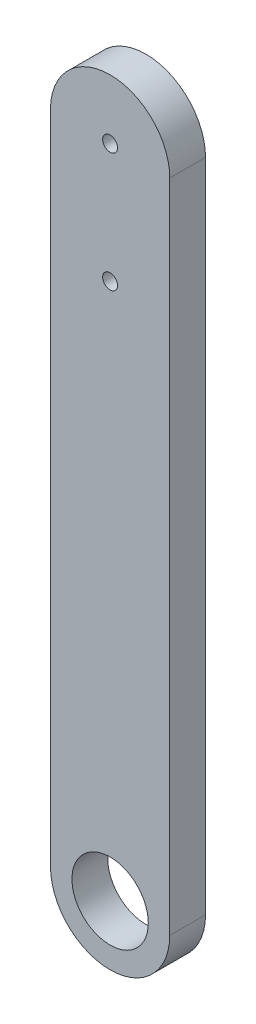
ISO-10303-21;
HEADER;
FILE_DESCRIPTION(('STEP AP214'),'2;1');
FILE_NAME('part.step','',(''),(''),'','','');
FILE_SCHEMA(('AUTOMOTIVE_DESIGN { 1 0 10303 214 1 1 1 1 }'));
ENDSEC;
DATA;
#1=APPLICATION_CONTEXT('core data for automotive mechanical design processes');
#2=APPLICATION_PROTOCOL_DEFINITION('international standard','automotive_design',2000,#1);
#3=PRODUCT_CONTEXT('',#1,'mechanical');
#4=PRODUCT('Part','Part','',(#3));
#5=PRODUCT_RELATED_PRODUCT_CATEGORY('part','',(#4));
#6=PRODUCT_DEFINITION_FORMATION('','',#4);
#7=PRODUCT_DEFINITION_CONTEXT('part definition',#1,'design');
#8=PRODUCT_DEFINITION('design','',#6,#7);
#9=PRODUCT_DEFINITION_SHAPE('','',#8);
#10=(LENGTH_UNIT() NAMED_UNIT(*) SI_UNIT(.MILLI.,.METRE.));
#11=(NAMED_UNIT(*) PLANE_ANGLE_UNIT() SI_UNIT($,.RADIAN.));
#12=(NAMED_UNIT(*) SI_UNIT($,.STERADIAN.) SOLID_ANGLE_UNIT());
#13=UNCERTAINTY_MEASURE_WITH_UNIT(LENGTH_MEASURE(1.E-05),#10,'distance_accuracy_value','');
#14=(GEOMETRIC_REPRESENTATION_CONTEXT(3) GLOBAL_UNCERTAINTY_ASSIGNED_CONTEXT((#13)) GLOBAL_UNIT_ASSIGNED_CONTEXT((#10,
#11,#12)) REPRESENTATION_CONTEXT('',''));
#15=CARTESIAN_POINT('',(0.,0.,0.));
#16=DIRECTION('',(0.,0.,1.));
#17=DIRECTION('',(1.,0.,0.));
#18=AXIS2_PLACEMENT_3D('',#15,#16,#17);
#19=CARTESIAN_POINT('',(-69.1410726802654,-13.6999999999981,6.));
#20=DIRECTION('',(0.,0.,1.));
#21=DIRECTION('',(1.,0.,0.));
#22=AXIS2_PLACEMENT_3D('',#19,#20,#21);
#23=PLANE('',#22);
#24=CARTESIAN_POINT('',(-69.1410726802654,-13.6999999999981,6.));
#25=DIRECTION('',(0.,0.,1.));
#26=DIRECTION('',(1.,0.,0.));
#27=AXIS2_PLACEMENT_3D('',#24,#25,#26);
#28=CIRCLE('',#27,1.24999999999997);
#29=CARTESIAN_POINT('',(-67.8910726802655,-13.6999999999981,6.));
#30=VERTEX_POINT('',#29);
#31=EDGE_CURVE('E142',#30,#30,#28,.T.);
#32=ORIENTED_EDGE('',*,*,#31,.F.);
#33=EDGE_LOOP('',(#32));
#34=FACE_BOUND('',#33,.T.);
#35=CARTESIAN_POINT('',(-69.1410726802654,-13.6999999999981,6.));
#36=DIRECTION('',(0.,0.,1.));
#37=DIRECTION('',(1.,0.,0.));
#38=AXIS2_PLACEMENT_3D('',#35,#36,#37);
#39=CIRCLE('',#38,10.);
#40=CARTESIAN_POINT('',(-59.1410726802654,-13.6999999999981,6.));
#41=VERTEX_POINT('',#40);
#42=CARTESIAN_POINT('',(-79.1410726802655,-13.6999999999981,6.));
#43=VERTEX_POINT('',#42);
#44=EDGE_CURVE('E98',#41,#43,#39,.T.);
#45=ORIENTED_EDGE('',*,*,#44,.T.);
#46=DIRECTION('',(0.,-1.,0.));
#47=VECTOR('',#46,1.);
#48=CARTESIAN_POINT('',(-79.1410726802655,-13.6999999999981,6.));
#49=LINE('',#48,#47);
#50=CARTESIAN_POINT('',(-79.1410726802654,-123.699999999998,6.));
#51=VERTEX_POINT('',#50);
#52=EDGE_CURVE('E93',#43,#51,#49,.T.);
#53=ORIENTED_EDGE('',*,*,#52,.T.);
#54=CARTESIAN_POINT('',(-69.1410726802654,-123.699999999998,6.));
#55=DIRECTION('',(0.,0.,1.));
#56=DIRECTION('',(1.,0.,0.));
#57=AXIS2_PLACEMENT_3D('',#54,#55,#56);
#58=CIRCLE('',#57,10.);
#59=CARTESIAN_POINT('',(-59.1410726802654,-123.699999999998,6.));
#60=VERTEX_POINT('',#59);
#61=EDGE_CURVE('E96',#51,#60,#58,.T.);
#62=ORIENTED_EDGE('',*,*,#61,.T.);
#63=DIRECTION('',(0.,1.,0.));
#64=VECTOR('',#63,1.);
#65=CARTESIAN_POINT('',(-59.1410726802654,-123.699999999998,6.));
#66=LINE('',#65,#64);
#67=EDGE_CURVE('E63',#60,#41,#66,.T.);
#68=ORIENTED_EDGE('',*,*,#67,.T.);
#69=EDGE_LOOP('',(#45,#53,#62,#68));
#70=FACE_BOUND('',#69,.T.);
#71=CARTESIAN_POINT('',(-69.1410726802654,-33.6999999999981,6.));
#72=DIRECTION('',(0.,0.,1.));
#73=DIRECTION('',(1.,0.,0.));
#74=AXIS2_PLACEMENT_3D('',#71,#72,#73);
#75=CIRCLE('',#74,1.24999999999999);
#76=CARTESIAN_POINT('',(-67.8910726802654,-33.6999999999981,6.));
#77=VERTEX_POINT('',#76);
#78=EDGE_CURVE('E120',#77,#77,#75,.T.);
#79=ORIENTED_EDGE('',*,*,#78,.F.);
#80=EDGE_LOOP('',(#79));
#81=FACE_BOUND('',#80,.T.);
#82=CARTESIAN_POINT('',(-69.1410726802654,-123.699999999998,6.));
#83=DIRECTION('',(0.,0.,1.));
#84=DIRECTION('',(1.,0.,0.));
#85=AXIS2_PLACEMENT_3D('',#82,#83,#84);
#86=CIRCLE('',#85,6.40000000000001);
#87=CARTESIAN_POINT('',(-62.7410726802654,-123.699999999998,6.));
#88=VERTEX_POINT('',#87);
#89=EDGE_CURVE('E150',#88,#88,#86,.T.);
#90=ORIENTED_EDGE('',*,*,#89,.F.);
#91=EDGE_LOOP('',(#90));
#92=FACE_BOUND('',#91,.T.);
#93=ADVANCED_FACE('F45',(#34,#70,#81,#92),#23,.T.);
#94=CARTESIAN_POINT('',(-69.1410726802654,-13.6999999999981,0.));
#95=DIRECTION('',(0.,0.,1.));
#96=DIRECTION('',(1.,0.,0.));
#97=AXIS2_PLACEMENT_3D('',#94,#95,#96);
#98=PLANE('',#97);
#99=CARTESIAN_POINT('',(-69.1410726802654,-13.6999999999981,0.));
#100=DIRECTION('',(0.,0.,1.));
#101=DIRECTION('',(1.,0.,0.));
#102=AXIS2_PLACEMENT_3D('',#99,#100,#101);
#103=CIRCLE('',#102,10.);
#104=CARTESIAN_POINT('',(-59.1410726802654,-13.6999999999981,0.));
#105=VERTEX_POINT('',#104);
#106=CARTESIAN_POINT('',(-79.1410726802655,-13.6999999999981,0.));
#107=VERTEX_POINT('',#106);
#108=EDGE_CURVE('E116',#105,#107,#103,.T.);
#109=ORIENTED_EDGE('',*,*,#108,.F.);
#110=DIRECTION('',(0.,1.,0.));
#111=VECTOR('',#110,1.);
#112=CARTESIAN_POINT('',(-59.1410726802654,-123.699999999998,0.));
#113=LINE('',#112,#111);
#114=CARTESIAN_POINT('',(-59.1410726802654,-123.699999999998,0.));
#115=VERTEX_POINT('',#114);
#116=EDGE_CURVE('E86',#115,#105,#113,.T.);
#117=ORIENTED_EDGE('',*,*,#116,.F.);
#118=CARTESIAN_POINT('',(-69.1410726802654,-123.699999999998,0.));
#119=DIRECTION('',(0.,0.,1.));
#120=DIRECTION('',(1.,0.,0.));
#121=AXIS2_PLACEMENT_3D('',#118,#119,#120);
#122=CIRCLE('',#121,10.);
#123=CARTESIAN_POINT('',(-79.1410726802654,-123.699999999998,0.));
#124=VERTEX_POINT('',#123);
#125=EDGE_CURVE('E80',#124,#115,#122,.T.);
#126=ORIENTED_EDGE('',*,*,#125,.F.);
#127=DIRECTION('',(0.,-1.,0.));
#128=VECTOR('',#127,1.);
#129=CARTESIAN_POINT('',(-79.1410726802655,-13.6999999999981,0.));
#130=LINE('',#129,#128);
#131=EDGE_CURVE('E103',#107,#124,#130,.T.);
#132=ORIENTED_EDGE('',*,*,#131,.F.);
#133=EDGE_LOOP('',(#109,#117,#126,#132));
#134=FACE_BOUND('',#133,.T.);
#135=CARTESIAN_POINT('',(-69.1410726802654,-33.6999999999981,0.));
#136=DIRECTION('',(0.,0.,1.));
#137=DIRECTION('',(1.,0.,0.));
#138=AXIS2_PLACEMENT_3D('',#135,#136,#137);
#139=CIRCLE('',#138,1.24999999999999);
#140=CARTESIAN_POINT('',(-67.8910726802654,-33.6999999999981,0.));
#141=VERTEX_POINT('',#140);
#142=EDGE_CURVE('E139',#141,#141,#139,.T.);
#143=ORIENTED_EDGE('',*,*,#142,.T.);
#144=EDGE_LOOP('',(#143));
#145=FACE_BOUND('',#144,.T.);
#146=CARTESIAN_POINT('',(-69.1410726802654,-13.6999999999981,0.));
#147=DIRECTION('',(0.,0.,1.));
#148=DIRECTION('',(1.,0.,0.));
#149=AXIS2_PLACEMENT_3D('',#146,#147,#148);
#150=CIRCLE('',#149,1.24999999999997);
#151=CARTESIAN_POINT('',(-67.8910726802655,-13.6999999999981,0.));
#152=VERTEX_POINT('',#151);
#153=EDGE_CURVE('E146',#152,#152,#150,.T.);
#154=ORIENTED_EDGE('',*,*,#153,.T.);
#155=EDGE_LOOP('',(#154));
#156=FACE_BOUND('',#155,.T.);
#157=CARTESIAN_POINT('',(-69.1410726802654,-123.699999999998,0.));
#158=DIRECTION('',(0.,0.,1.));
#159=DIRECTION('',(1.,0.,0.));
#160=AXIS2_PLACEMENT_3D('',#157,#158,#159);
#161=CIRCLE('',#160,6.40000000000001);
#162=CARTESIAN_POINT('',(-62.7410726802654,-123.699999999998,0.));
#163=VERTEX_POINT('',#162);
#164=EDGE_CURVE('E153',#163,#163,#161,.T.);
#165=ORIENTED_EDGE('',*,*,#164,.T.);
#166=EDGE_LOOP('',(#165));
#167=FACE_BOUND('',#166,.T.);
#168=ADVANCED_FACE('F134',(#134,#145,#156,#167),#98,.F.);
#169=CARTESIAN_POINT('',(-69.1410726802654,-13.6999999999981,6.));
#170=DIRECTION('',(0.,0.,-1.));
#171=DIRECTION('',(-1.,0.,0.));
#172=AXIS2_PLACEMENT_3D('',#169,#170,#171);
#173=CYLINDRICAL_SURFACE('',#172,10.);
#174=ORIENTED_EDGE('',*,*,#108,.T.);
#175=DIRECTION('',(0.,0.,-1.));
#176=VECTOR('',#175,1.);
#177=CARTESIAN_POINT('',(-79.1410726802655,-13.6999999999981,6.));
#178=LINE('',#177,#176);
#179=EDGE_CURVE('E11',#43,#107,#178,.T.);
#180=ORIENTED_EDGE('',*,*,#179,.F.);
#181=ORIENTED_EDGE('',*,*,#44,.F.);
#182=DIRECTION('',(0.,0.,-1.));
#183=VECTOR('',#182,1.);
#184=CARTESIAN_POINT('',(-59.1410726802654,-13.6999999999981,6.));
#185=LINE('',#184,#183);
#186=EDGE_CURVE('E112',#41,#105,#185,.T.);
#187=ORIENTED_EDGE('',*,*,#186,.T.);
#188=EDGE_LOOP('',(#174,#180,#181,#187));
#189=FACE_BOUND('',#188,.T.);
#190=ADVANCED_FACE('F47',(#189),#173,.T.);
#191=CARTESIAN_POINT('',(-79.1410726802655,-13.6999999999981,6.));
#192=DIRECTION('',(1.,0.,0.));
#193=DIRECTION('',(0.,1.,0.));
#194=AXIS2_PLACEMENT_3D('',#191,#192,#193);
#195=PLANE('',#194);
#196=ORIENTED_EDGE('',*,*,#131,.T.);
#197=DIRECTION('',(0.,0.,-1.));
#198=VECTOR('',#197,1.);
#199=CARTESIAN_POINT('',(-79.1410726802654,-123.699999999998,6.));
#200=LINE('',#199,#198);
#201=EDGE_CURVE('E55',#51,#124,#200,.T.);
#202=ORIENTED_EDGE('',*,*,#201,.F.);
#203=ORIENTED_EDGE('',*,*,#52,.F.);
#204=ORIENTED_EDGE('',*,*,#179,.T.);
#205=EDGE_LOOP('',(#196,#202,#203,#204));
#206=FACE_BOUND('',#205,.T.);
#207=ADVANCED_FACE('F102',(#206),#195,.F.);
#208=CARTESIAN_POINT('',(-69.1410726802654,-123.699999999998,6.));
#209=DIRECTION('',(0.,0.,-1.));
#210=DIRECTION('',(-1.,0.,0.));
#211=AXIS2_PLACEMENT_3D('',#208,#209,#210);
#212=CYLINDRICAL_SURFACE('',#211,10.);
#213=ORIENTED_EDGE('',*,*,#125,.T.);
#214=DIRECTION('',(0.,0.,-1.));
#215=VECTOR('',#214,1.);
#216=CARTESIAN_POINT('',(-59.1410726802654,-123.699999999998,6.));
#217=LINE('',#216,#215);
#218=EDGE_CURVE('E105',#60,#115,#217,.T.);
#219=ORIENTED_EDGE('',*,*,#218,.F.);
#220=ORIENTED_EDGE('',*,*,#61,.F.);
#221=ORIENTED_EDGE('',*,*,#201,.T.);
#222=EDGE_LOOP('',(#213,#219,#220,#221));
#223=FACE_BOUND('',#222,.T.);
#224=ADVANCED_FACE('F106',(#223),#212,.T.);
#225=CARTESIAN_POINT('',(-59.1410726802654,-123.699999999998,6.));
#226=DIRECTION('',(-1.,0.,0.));
#227=DIRECTION('',(0.,-1.,0.));
#228=AXIS2_PLACEMENT_3D('',#225,#226,#227);
#229=PLANE('',#228);
#230=ORIENTED_EDGE('',*,*,#116,.T.);
#231=ORIENTED_EDGE('',*,*,#186,.F.);
#232=ORIENTED_EDGE('',*,*,#67,.F.);
#233=ORIENTED_EDGE('',*,*,#218,.T.);
#234=EDGE_LOOP('',(#230,#231,#232,#233));
#235=FACE_BOUND('',#234,.T.);
#236=ADVANCED_FACE('F131',(#235),#229,.F.);
#237=CARTESIAN_POINT('',(-69.1410726802654,-33.6999999999981,6.));
#238=DIRECTION('',(0.,0.,-1.));
#239=DIRECTION('',(-1.,0.,0.));
#240=AXIS2_PLACEMENT_3D('',#237,#238,#239);
#241=CYLINDRICAL_SURFACE('',#240,1.24999999999999);
#242=ORIENTED_EDGE('',*,*,#78,.T.);
#243=EDGE_LOOP('',(#242));
#244=FACE_BOUND('',#243,.T.);
#245=ORIENTED_EDGE('',*,*,#142,.F.);
#246=EDGE_LOOP('',(#245));
#247=FACE_BOUND('',#246,.T.);
#248=ADVANCED_FACE('F171',(#244,#247),#241,.F.);
#249=CARTESIAN_POINT('',(-69.1410726802654,-13.6999999999981,6.));
#250=DIRECTION('',(0.,0.,-1.));
#251=DIRECTION('',(-1.,0.,0.));
#252=AXIS2_PLACEMENT_3D('',#249,#250,#251);
#253=CYLINDRICAL_SURFACE('',#252,1.24999999999997);
#254=ORIENTED_EDGE('',*,*,#31,.T.);
#255=EDGE_LOOP('',(#254));
#256=FACE_BOUND('',#255,.T.);
#257=ORIENTED_EDGE('',*,*,#153,.F.);
#258=EDGE_LOOP('',(#257));
#259=FACE_BOUND('',#258,.T.);
#260=ADVANCED_FACE('F236',(#256,#259),#253,.F.);
#261=CARTESIAN_POINT('',(-69.1410726802654,-123.699999999998,6.));
#262=DIRECTION('',(0.,0.,-1.));
#263=DIRECTION('',(-1.,0.,0.));
#264=AXIS2_PLACEMENT_3D('',#261,#262,#263);
#265=CYLINDRICAL_SURFACE('',#264,6.40000000000001);
#266=ORIENTED_EDGE('',*,*,#89,.T.);
#267=EDGE_LOOP('',(#266));
#268=FACE_BOUND('',#267,.T.);
#269=ORIENTED_EDGE('',*,*,#164,.F.);
#270=EDGE_LOOP('',(#269));
#271=FACE_BOUND('',#270,.T.);
#272=ADVANCED_FACE('F160',(#268,#271),#265,.F.);
#273=CLOSED_SHELL('',(#93,#168,#190,#207,#224,#236,#248,#260,#272));
#274=MANIFOLD_SOLID_BREP('B2',#273);
#275=ADVANCED_BREP_SHAPE_REPRESENTATION('',(#18,#274),#14);
#276=SHAPE_DEFINITION_REPRESENTATION(#9,#275);
ENDSEC;
END-ISO-10303-21;
